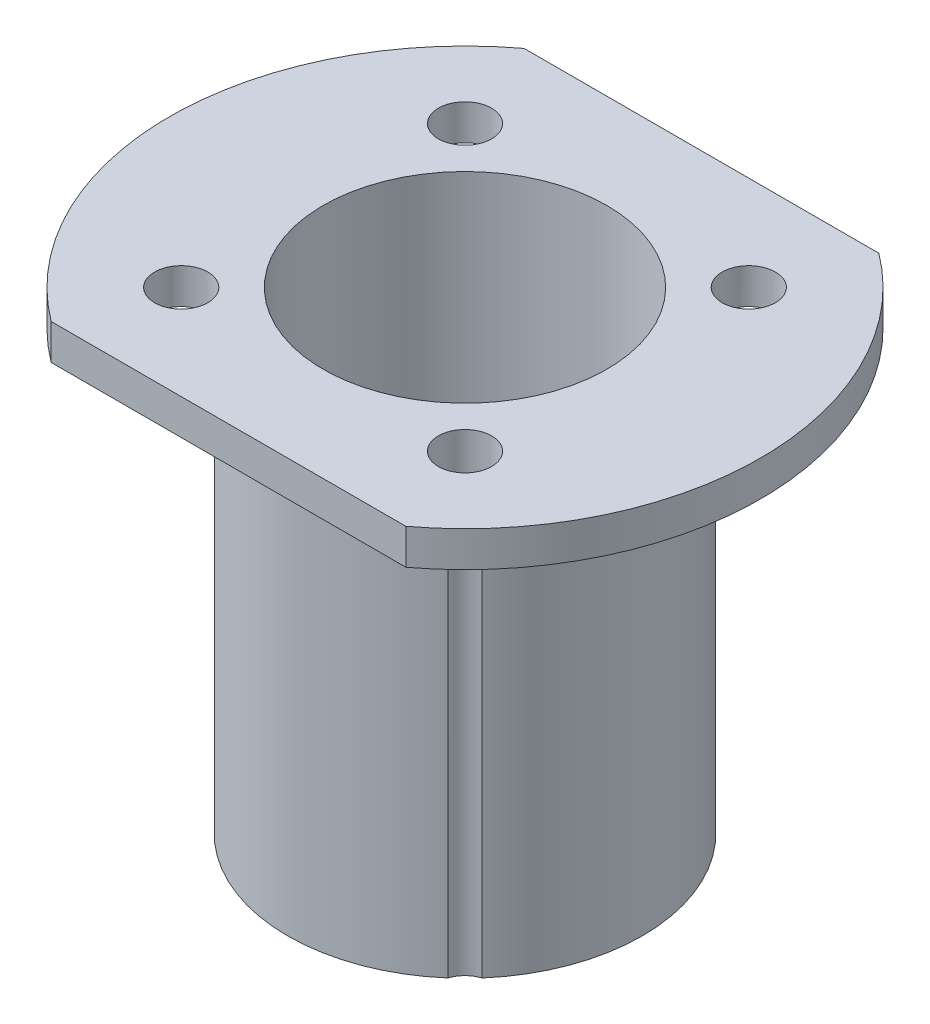
ISO-10303-21;
HEADER;
FILE_DESCRIPTION(('STEP AP214'),'2;1');
FILE_NAME('part.step','',(''),(''),'','','');
FILE_SCHEMA(('AUTOMOTIVE_DESIGN { 1 0 10303 214 1 1 1 1 }'));
ENDSEC;
DATA;
#1=APPLICATION_CONTEXT('core data for automotive mechanical design processes');
#2=APPLICATION_PROTOCOL_DEFINITION('international standard','automotive_design',2000,#1);
#3=PRODUCT_CONTEXT('',#1,'mechanical');
#4=PRODUCT('Part','Part','',(#3));
#5=PRODUCT_RELATED_PRODUCT_CATEGORY('part','',(#4));
#6=PRODUCT_DEFINITION_FORMATION('','',#4);
#7=PRODUCT_DEFINITION_CONTEXT('part definition',#1,'design');
#8=PRODUCT_DEFINITION('design','',#6,#7);
#9=PRODUCT_DEFINITION_SHAPE('','',#8);
#10=(LENGTH_UNIT() NAMED_UNIT(*) SI_UNIT(.MILLI.,.METRE.));
#11=(NAMED_UNIT(*) PLANE_ANGLE_UNIT() SI_UNIT($,.RADIAN.));
#12=(NAMED_UNIT(*) SI_UNIT($,.STERADIAN.) SOLID_ANGLE_UNIT());
#13=UNCERTAINTY_MEASURE_WITH_UNIT(LENGTH_MEASURE(1.E-05),#10,'distance_accuracy_value','');
#14=(GEOMETRIC_REPRESENTATION_CONTEXT(3) GLOBAL_UNCERTAINTY_ASSIGNED_CONTEXT((#13)) GLOBAL_UNIT_ASSIGNED_CONTEXT((#10,
#11,#12)) REPRESENTATION_CONTEXT('',''));
#15=CARTESIAN_POINT('',(0.,0.,0.));
#16=DIRECTION('',(0.,0.,1.));
#17=DIRECTION('',(1.,0.,0.));
#18=AXIS2_PLACEMENT_3D('',#15,#16,#17);
#19=CARTESIAN_POINT('',(0.,0.,0.));
#20=DIRECTION('',(0.,-1.,0.));
#21=DIRECTION('',(0.,0.,-1.));
#22=AXIS2_PLACEMENT_3D('',#19,#20,#21);
#23=CYLINDRICAL_SURFACE('',#22,15.);
#24=DIRECTION('',(0.,1.,0.));
#25=VECTOR('',#24,1.);
#26=CARTESIAN_POINT('',(-9.8604949556783,20.,-11.3035675443217));
#27=LINE('',#26,#25);
#28=CARTESIAN_POINT('',(-9.86049495567831,37.,-11.3035675443217));
#29=VERTEX_POINT('',#28);
#30=CARTESIAN_POINT('',(-9.8604949556783,0.,-11.3035675443217));
#31=VERTEX_POINT('',#30);
#32=EDGE_CURVE('E12',#29,#31,#27,.F.);
#33=ORIENTED_EDGE('',*,*,#32,.F.);
#34=CARTESIAN_POINT('',(0.,37.,0.));
#35=DIRECTION('',(0.,-1.,0.));
#36=DIRECTION('',(0.,0.,-1.));
#37=AXIS2_PLACEMENT_3D('',#34,#35,#36);
#38=CIRCLE('',#37,15.);
#39=CARTESIAN_POINT('',(9.86049495567869,37.,-11.3035675443214));
#40=VERTEX_POINT('',#39);
#41=EDGE_CURVE('E183',#29,#40,#38,.T.);
#42=ORIENTED_EDGE('',*,*,#41,.T.);
#43=DIRECTION('',(0.,1.,0.));
#44=VECTOR('',#43,1.);
#45=CARTESIAN_POINT('',(9.86049495567869,20.,-11.3035675443213));
#46=LINE('',#45,#44);
#47=CARTESIAN_POINT('',(9.86049495567869,0.,-11.3035675443214));
#48=VERTEX_POINT('',#47);
#49=EDGE_CURVE('E137',#48,#40,#46,.T.);
#50=ORIENTED_EDGE('',*,*,#49,.F.);
#51=CARTESIAN_POINT('',(0.,0.,0.));
#52=DIRECTION('',(0.,-1.,0.));
#53=DIRECTION('',(0.,0.,-1.));
#54=AXIS2_PLACEMENT_3D('',#51,#52,#53);
#55=CIRCLE('',#54,15.);
#56=EDGE_CURVE('E55',#31,#48,#55,.T.);
#57=ORIENTED_EDGE('',*,*,#56,.F.);
#58=EDGE_LOOP('',(#33,#42,#50,#57));
#59=FACE_BOUND('',#58,.T.);
#60=ADVANCED_FACE('F34',(#59),#23,.T.);
#61=DIRECTION('',(0.,1.,0.));
#62=VECTOR('',#61,1.);
#63=CARTESIAN_POINT('',(11.3035675443207,20.,-9.8604949556794));
#64=LINE('',#63,#62);
#65=CARTESIAN_POINT('',(11.3035675443207,37.,-9.86049495567941));
#66=VERTEX_POINT('',#65);
#67=CARTESIAN_POINT('',(11.3035675443207,0.,-9.8604949556794));
#68=VERTEX_POINT('',#67);
#69=EDGE_CURVE('E174',#66,#68,#64,.F.);
#70=ORIENTED_EDGE('',*,*,#69,.F.);
#71=CARTESIAN_POINT('',(11.3035675443223,37.,9.86049495567759));
#72=VERTEX_POINT('',#71);
#73=EDGE_CURVE('E189',#66,#72,#38,.T.);
#74=ORIENTED_EDGE('',*,*,#73,.T.);
#75=DIRECTION('',(0.,1.,0.));
#76=VECTOR('',#75,1.);
#77=CARTESIAN_POINT('',(11.3035675443223,20.,9.86049495567758));
#78=LINE('',#77,#76);
#79=CARTESIAN_POINT('',(11.3035675443223,0.,9.86049495567759));
#80=VERTEX_POINT('',#79);
#81=EDGE_CURVE('E168',#80,#72,#78,.T.);
#82=ORIENTED_EDGE('',*,*,#81,.F.);
#83=EDGE_CURVE('E138',#68,#80,#55,.T.);
#84=ORIENTED_EDGE('',*,*,#83,.F.);
#85=EDGE_LOOP('',(#70,#74,#82,#84));
#86=FACE_BOUND('',#85,.T.);
#87=ADVANCED_FACE('F274',(#86),#23,.T.);
#88=DIRECTION('',(0.,1.,0.));
#89=VECTOR('',#88,1.);
#90=CARTESIAN_POINT('',(9.86049495567904,20.,11.303567544321));
#91=LINE('',#90,#89);
#92=CARTESIAN_POINT('',(9.86049495567905,37.,11.303567544321));
#93=VERTEX_POINT('',#92);
#94=CARTESIAN_POINT('',(9.86049495567904,0.,11.303567544321));
#95=VERTEX_POINT('',#94);
#96=EDGE_CURVE('E171',#93,#95,#91,.F.);
#97=ORIENTED_EDGE('',*,*,#96,.F.);
#98=CARTESIAN_POINT('',(-9.86049495567721,37.,11.3035675443226));
#99=VERTEX_POINT('',#98);
#100=EDGE_CURVE('E188',#93,#99,#38,.T.);
#101=ORIENTED_EDGE('',*,*,#100,.T.);
#102=DIRECTION('',(0.,1.,0.));
#103=VECTOR('',#102,1.);
#104=CARTESIAN_POINT('',(-9.86049495567721,20.,11.3035675443226));
#105=LINE('',#104,#103);
#106=CARTESIAN_POINT('',(-9.86049495567721,0.,11.3035675443226));
#107=VERTEX_POINT('',#106);
#108=EDGE_CURVE('E163',#107,#99,#105,.T.);
#109=ORIENTED_EDGE('',*,*,#108,.F.);
#110=EDGE_CURVE('E141',#95,#107,#55,.T.);
#111=ORIENTED_EDGE('',*,*,#110,.F.);
#112=EDGE_LOOP('',(#97,#101,#109,#111));
#113=FACE_BOUND('',#112,.T.);
#114=ADVANCED_FACE('F242',(#113),#23,.T.);
#115=CARTESIAN_POINT('',(25.,40.,0.));
#116=DIRECTION('',(0.,1.,0.));
#117=DIRECTION('',(0.,0.,1.));
#118=AXIS2_PLACEMENT_3D('',#115,#116,#117);
#119=PLANE('',#118);
#120=CARTESIAN_POINT('',(-12.,40.,-12.));
#121=DIRECTION('',(0.,1.,0.));
#122=DIRECTION('',(0.,0.,1.));
#123=AXIS2_PLACEMENT_3D('',#120,#121,#122);
#124=CIRCLE('',#123,2.25);
#125=CARTESIAN_POINT('',(-12.,40.,-9.75));
#126=VERTEX_POINT('',#125);
#127=EDGE_CURVE('E133',#126,#126,#124,.T.);
#128=ORIENTED_EDGE('',*,*,#127,.F.);
#129=EDGE_LOOP('',(#128));
#130=FACE_BOUND('',#129,.T.);
#131=CARTESIAN_POINT('',(12.,40.,-12.0000000000008));
#132=DIRECTION('',(0.,1.,0.));
#133=DIRECTION('',(0.,0.,1.));
#134=AXIS2_PLACEMENT_3D('',#131,#132,#133);
#135=CIRCLE('',#134,2.25);
#136=CARTESIAN_POINT('',(12.,40.,-9.75000000000076));
#137=VERTEX_POINT('',#136);
#138=EDGE_CURVE('E184',#137,#137,#135,.T.);
#139=ORIENTED_EDGE('',*,*,#138,.F.);
#140=EDGE_LOOP('',(#139));
#141=FACE_BOUND('',#140,.T.);
#142=CARTESIAN_POINT('',(12.0000000000008,40.,11.9999999999992));
#143=DIRECTION('',(0.,1.,0.));
#144=DIRECTION('',(0.,0.,1.));
#145=AXIS2_PLACEMENT_3D('',#142,#143,#144);
#146=CIRCLE('',#145,2.25);
#147=CARTESIAN_POINT('',(12.0000000000008,40.,14.2499999999992));
#148=VERTEX_POINT('',#147);
#149=EDGE_CURVE('E228',#148,#148,#146,.T.);
#150=ORIENTED_EDGE('',*,*,#149,.F.);
#151=EDGE_LOOP('',(#150));
#152=FACE_BOUND('',#151,.T.);
#153=CARTESIAN_POINT('',(-11.9999999999992,40.,12.));
#154=DIRECTION('',(0.,1.,0.));
#155=DIRECTION('',(0.,0.,1.));
#156=AXIS2_PLACEMENT_3D('',#153,#154,#155);
#157=CIRCLE('',#156,2.25);
#158=CARTESIAN_POINT('',(-11.9999999999992,40.,14.25));
#159=VERTEX_POINT('',#158);
#160=EDGE_CURVE('E220',#159,#159,#157,.T.);
#161=ORIENTED_EDGE('',*,*,#160,.F.);
#162=EDGE_LOOP('',(#161));
#163=FACE_BOUND('',#162,.T.);
#164=CARTESIAN_POINT('',(0.,40.,0.));
#165=DIRECTION('',(0.,-1.,0.));
#166=DIRECTION('',(0.,0.,-1.));
#167=AXIS2_PLACEMENT_3D('',#164,#165,#166);
#168=CIRCLE('',#167,12.);
#169=CARTESIAN_POINT('',(0.,40.,-12.));
#170=VERTEX_POINT('',#169);
#171=EDGE_CURVE('E148',#170,#170,#168,.T.);
#172=ORIENTED_EDGE('',*,*,#171,.T.);
#173=EDGE_LOOP('',(#172));
#174=FACE_BOUND('',#173,.T.);
#175=CARTESIAN_POINT('',(0.,40.,0.));
#176=DIRECTION('',(0.,-1.,0.));
#177=DIRECTION('',(0.,0.,-1.));
#178=AXIS2_PLACEMENT_3D('',#175,#176,#177);
#179=CIRCLE('',#178,25.);
#180=CARTESIAN_POINT('',(15.,40.,-20.));
#181=VERTEX_POINT('',#180);
#182=CARTESIAN_POINT('',(15.,40.,20.));
#183=VERTEX_POINT('',#182);
#184=EDGE_CURVE('E201',#181,#183,#179,.T.);
#185=ORIENTED_EDGE('',*,*,#184,.F.);
#186=DIRECTION('',(-1.,0.,0.));
#187=VECTOR('',#186,1.);
#188=CARTESIAN_POINT('',(49.765,40.,-20.));
#189=LINE('',#188,#187);
#190=CARTESIAN_POINT('',(-15.,40.,-20.));
#191=VERTEX_POINT('',#190);
#192=EDGE_CURVE('E210',#181,#191,#189,.T.);
#193=ORIENTED_EDGE('',*,*,#192,.T.);
#194=CARTESIAN_POINT('',(-15.,40.,20.));
#195=VERTEX_POINT('',#194);
#196=EDGE_CURVE('E205',#195,#191,#179,.T.);
#197=ORIENTED_EDGE('',*,*,#196,.F.);
#198=DIRECTION('',(1.,0.,0.));
#199=VECTOR('',#198,1.);
#200=CARTESIAN_POINT('',(49.765,40.,20.));
#201=LINE('',#200,#199);
#202=EDGE_CURVE('E213',#195,#183,#201,.T.);
#203=ORIENTED_EDGE('',*,*,#202,.T.);
#204=EDGE_LOOP('',(#185,#193,#197,#203));
#205=FACE_BOUND('',#204,.T.);
#206=ADVANCED_FACE('F36',(#130,#141,#152,#163,#174,#205),#119,.T.);
#207=CARTESIAN_POINT('',(15.,37.,0.));
#208=DIRECTION('',(0.,-1.,0.));
#209=DIRECTION('',(0.,0.,-1.));
#210=AXIS2_PLACEMENT_3D('',#207,#208,#209);
#211=PLANE('',#210);
#212=CARTESIAN_POINT('',(-12.,37.,-12.));
#213=DIRECTION('',(0.,-1.,0.));
#214=DIRECTION('',(0.,0.,-1.));
#215=AXIS2_PLACEMENT_3D('',#212,#213,#214);
#216=CIRCLE('',#215,2.24999999999999);
#217=CARTESIAN_POINT('',(-11.3035675443217,37.,-9.86049495567833));
#218=VERTEX_POINT('',#217);
#219=EDGE_CURVE('E124',#218,#29,#216,.T.);
#220=ORIENTED_EDGE('',*,*,#219,.F.);
#221=CARTESIAN_POINT('',(-11.303567544322,37.,9.86049495567793));
#222=VERTEX_POINT('',#221);
#223=EDGE_CURVE('E144',#222,#218,#38,.T.);
#224=ORIENTED_EDGE('',*,*,#223,.F.);
#225=CARTESIAN_POINT('',(-11.9999999999992,37.,12.));
#226=DIRECTION('',(0.,-1.,0.));
#227=DIRECTION('',(0.,0.,-1.));
#228=AXIS2_PLACEMENT_3D('',#225,#226,#227);
#229=CIRCLE('',#228,2.24999999999999);
#230=EDGE_CURVE('E216',#99,#222,#229,.T.);
#231=ORIENTED_EDGE('',*,*,#230,.F.);
#232=ORIENTED_EDGE('',*,*,#100,.F.);
#233=CARTESIAN_POINT('',(12.0000000000008,37.,11.9999999999992));
#234=DIRECTION('',(0.,-1.,0.));
#235=DIRECTION('',(0.,0.,-1.));
#236=AXIS2_PLACEMENT_3D('',#233,#234,#235);
#237=CIRCLE('',#236,2.24999999999999);
#238=EDGE_CURVE('E223',#72,#93,#237,.T.);
#239=ORIENTED_EDGE('',*,*,#238,.F.);
#240=ORIENTED_EDGE('',*,*,#73,.F.);
#241=CARTESIAN_POINT('',(12.,37.,-12.0000000000008));
#242=DIRECTION('',(0.,-1.,0.));
#243=DIRECTION('',(0.,0.,-1.));
#244=AXIS2_PLACEMENT_3D('',#241,#242,#243);
#245=CIRCLE('',#244,2.24999999999999);
#246=EDGE_CURVE('E231',#40,#66,#245,.T.);
#247=ORIENTED_EDGE('',*,*,#246,.F.);
#248=ORIENTED_EDGE('',*,*,#41,.F.);
#249=EDGE_LOOP('',(#220,#224,#231,#232,#239,#240,#247,#248));
#250=FACE_BOUND('',#249,.T.);
#251=CARTESIAN_POINT('',(0.,37.,0.));
#252=DIRECTION('',(0.,-1.,0.));
#253=DIRECTION('',(0.,0.,-1.));
#254=AXIS2_PLACEMENT_3D('',#251,#252,#253);
#255=CIRCLE('',#254,25.);
#256=CARTESIAN_POINT('',(-15.,37.,20.));
#257=VERTEX_POINT('',#256);
#258=CARTESIAN_POINT('',(-15.,37.,-20.));
#259=VERTEX_POINT('',#258);
#260=EDGE_CURVE('E196',#257,#259,#255,.T.);
#261=ORIENTED_EDGE('',*,*,#260,.T.);
#262=DIRECTION('',(1.,0.,0.));
#263=VECTOR('',#262,1.);
#264=CARTESIAN_POINT('',(15.,37.,-20.));
#265=LINE('',#264,#263);
#266=CARTESIAN_POINT('',(15.,37.,-20.));
#267=VERTEX_POINT('',#266);
#268=EDGE_CURVE('E206',#259,#267,#265,.T.);
#269=ORIENTED_EDGE('',*,*,#268,.T.);
#270=CARTESIAN_POINT('',(15.,37.,20.));
#271=VERTEX_POINT('',#270);
#272=EDGE_CURVE('E190',#267,#271,#255,.T.);
#273=ORIENTED_EDGE('',*,*,#272,.T.);
#274=DIRECTION('',(-1.,0.,0.));
#275=VECTOR('',#274,1.);
#276=CARTESIAN_POINT('',(15.,37.,20.));
#277=LINE('',#276,#275);
#278=EDGE_CURVE('E208',#271,#257,#277,.T.);
#279=ORIENTED_EDGE('',*,*,#278,.T.);
#280=EDGE_LOOP('',(#261,#269,#273,#279));
#281=FACE_BOUND('',#280,.T.);
#282=ADVANCED_FACE('F179',(#250,#281),#211,.T.);
#283=CARTESIAN_POINT('',(0.,0.,0.));
#284=DIRECTION('',(0.,-1.,0.));
#285=DIRECTION('',(0.,0.,-1.));
#286=AXIS2_PLACEMENT_3D('',#283,#284,#285);
#287=CYLINDRICAL_SURFACE('',#286,25.);
#288=ORIENTED_EDGE('',*,*,#272,.F.);
#289=DIRECTION('',(0.,-1.,0.));
#290=VECTOR('',#289,1.);
#291=CARTESIAN_POINT('',(15.,0.,-20.));
#292=LINE('',#291,#290);
#293=EDGE_CURVE('E160',#267,#181,#292,.F.);
#294=ORIENTED_EDGE('',*,*,#293,.T.);
#295=ORIENTED_EDGE('',*,*,#184,.T.);
#296=DIRECTION('',(0.,-1.,0.));
#297=VECTOR('',#296,1.);
#298=CARTESIAN_POINT('',(15.,0.,20.));
#299=LINE('',#298,#297);
#300=EDGE_CURVE('E151',#183,#271,#299,.T.);
#301=ORIENTED_EDGE('',*,*,#300,.T.);
#302=EDGE_LOOP('',(#288,#294,#295,#301));
#303=FACE_BOUND('',#302,.T.);
#304=ADVANCED_FACE('F255',(#303),#287,.T.);
#305=ORIENTED_EDGE('',*,*,#196,.T.);
#306=DIRECTION('',(0.,-1.,0.));
#307=VECTOR('',#306,1.);
#308=CARTESIAN_POINT('',(-15.,0.,-20.));
#309=LINE('',#308,#307);
#310=EDGE_CURVE('E157',#191,#259,#309,.T.);
#311=ORIENTED_EDGE('',*,*,#310,.T.);
#312=ORIENTED_EDGE('',*,*,#260,.F.);
#313=DIRECTION('',(0.,-1.,0.));
#314=VECTOR('',#313,1.);
#315=CARTESIAN_POINT('',(-15.,0.,20.));
#316=LINE('',#315,#314);
#317=EDGE_CURVE('E154',#257,#195,#316,.F.);
#318=ORIENTED_EDGE('',*,*,#317,.T.);
#319=EDGE_LOOP('',(#305,#311,#312,#318));
#320=FACE_BOUND('',#319,.T.);
#321=ADVANCED_FACE('F260',(#320),#287,.T.);
#322=CARTESIAN_POINT('',(0.,0.,0.));
#323=DIRECTION('',(0.,-1.,0.));
#324=DIRECTION('',(0.,0.,-1.));
#325=AXIS2_PLACEMENT_3D('',#322,#323,#324);
#326=CYLINDRICAL_SURFACE('',#325,12.);
#327=CARTESIAN_POINT('',(0.,0.,0.));
#328=DIRECTION('',(0.,-1.,0.));
#329=DIRECTION('',(0.,0.,-1.));
#330=AXIS2_PLACEMENT_3D('',#327,#328,#329);
#331=CIRCLE('',#330,12.);
#332=CARTESIAN_POINT('',(0.,0.,-12.));
#333=VERTEX_POINT('',#332);
#334=EDGE_CURVE('E140',#333,#333,#331,.T.);
#335=ORIENTED_EDGE('',*,*,#334,.T.);
#336=EDGE_LOOP('',(#335));
#337=FACE_BOUND('',#336,.T.);
#338=ORIENTED_EDGE('',*,*,#171,.F.);
#339=EDGE_LOOP('',(#338));
#340=FACE_BOUND('',#339,.T.);
#341=ADVANCED_FACE('F282',(#337,#340),#326,.F.);
#342=CARTESIAN_POINT('',(12.,0.,0.));
#343=DIRECTION('',(0.,-1.,0.));
#344=DIRECTION('',(0.,0.,-1.));
#345=AXIS2_PLACEMENT_3D('',#342,#343,#344);
#346=PLANE('',#345);
#347=CARTESIAN_POINT('',(-12.,0.,-12.));
#348=DIRECTION('',(0.,1.,0.));
#349=DIRECTION('',(0.,0.,1.));
#350=AXIS2_PLACEMENT_3D('',#347,#348,#349);
#351=CIRCLE('',#350,2.24999999999999);
#352=CARTESIAN_POINT('',(-11.3035675443217,0.,-9.86049495567833));
#353=VERTEX_POINT('',#352);
#354=EDGE_CURVE('E48',#353,#31,#351,.T.);
#355=ORIENTED_EDGE('',*,*,#354,.T.);
#356=ORIENTED_EDGE('',*,*,#56,.T.);
#357=CARTESIAN_POINT('',(12.,0.,-12.0000000000008));
#358=DIRECTION('',(0.,1.,0.));
#359=DIRECTION('',(0.,0.,1.));
#360=AXIS2_PLACEMENT_3D('',#357,#358,#359);
#361=CIRCLE('',#360,2.24999999999999);
#362=EDGE_CURVE('E233',#48,#68,#361,.T.);
#363=ORIENTED_EDGE('',*,*,#362,.T.);
#364=ORIENTED_EDGE('',*,*,#83,.T.);
#365=CARTESIAN_POINT('',(12.0000000000008,0.,11.9999999999992));
#366=DIRECTION('',(0.,1.,0.));
#367=DIRECTION('',(0.,0.,1.));
#368=AXIS2_PLACEMENT_3D('',#365,#366,#367);
#369=CIRCLE('',#368,2.24999999999999);
#370=EDGE_CURVE('E225',#80,#95,#369,.T.);
#371=ORIENTED_EDGE('',*,*,#370,.T.);
#372=ORIENTED_EDGE('',*,*,#110,.T.);
#373=CARTESIAN_POINT('',(-11.9999999999992,0.,12.));
#374=DIRECTION('',(0.,1.,0.));
#375=DIRECTION('',(0.,0.,1.));
#376=AXIS2_PLACEMENT_3D('',#373,#374,#375);
#377=CIRCLE('',#376,2.24999999999999);
#378=CARTESIAN_POINT('',(-11.303567544322,0.,9.86049495567793));
#379=VERTEX_POINT('',#378);
#380=EDGE_CURVE('E218',#107,#379,#377,.T.);
#381=ORIENTED_EDGE('',*,*,#380,.T.);
#382=EDGE_CURVE('E132',#379,#353,#55,.T.);
#383=ORIENTED_EDGE('',*,*,#382,.T.);
#384=EDGE_LOOP('',(#355,#356,#363,#364,#371,#372,#381,#383));
#385=FACE_BOUND('',#384,.T.);
#386=ORIENTED_EDGE('',*,*,#334,.F.);
#387=EDGE_LOOP('',(#386));
#388=FACE_BOUND('',#387,.T.);
#389=ADVANCED_FACE('F128',(#385,#388),#346,.T.);
#390=DIRECTION('',(0.,1.,0.));
#391=VECTOR('',#390,1.);
#392=CARTESIAN_POINT('',(-11.3035675443217,20.,-9.86049495567833));
#393=LINE('',#392,#391);
#394=EDGE_CURVE('E42',#353,#218,#393,.T.);
#395=ORIENTED_EDGE('',*,*,#394,.F.);
#396=ORIENTED_EDGE('',*,*,#382,.F.);
#397=DIRECTION('',(0.,1.,0.));
#398=VECTOR('',#397,1.);
#399=CARTESIAN_POINT('',(-11.303567544322,20.,9.86049495567793));
#400=LINE('',#399,#398);
#401=EDGE_CURVE('E166',#222,#379,#400,.F.);
#402=ORIENTED_EDGE('',*,*,#401,.F.);
#403=ORIENTED_EDGE('',*,*,#223,.T.);
#404=EDGE_LOOP('',(#395,#396,#402,#403));
#405=FACE_BOUND('',#404,.T.);
#406=ADVANCED_FACE('F187',(#405),#23,.T.);
#407=CARTESIAN_POINT('',(49.765,-1.2E-05,20.));
#408=DIRECTION('',(0.,0.,1.));
#409=DIRECTION('',(1.,0.,0.));
#410=AXIS2_PLACEMENT_3D('',#407,#408,#409);
#411=PLANE('',#410);
#412=ORIENTED_EDGE('',*,*,#278,.F.);
#413=ORIENTED_EDGE('',*,*,#300,.F.);
#414=ORIENTED_EDGE('',*,*,#202,.F.);
#415=ORIENTED_EDGE('',*,*,#317,.F.);
#416=EDGE_LOOP('',(#412,#413,#414,#415));
#417=FACE_BOUND('',#416,.T.);
#418=ADVANCED_FACE('F262',(#417),#411,.T.);
#419=CARTESIAN_POINT('',(49.765,-1.2E-05,-20.));
#420=DIRECTION('',(0.,0.,-1.));
#421=DIRECTION('',(-1.,0.,0.));
#422=AXIS2_PLACEMENT_3D('',#419,#420,#421);
#423=PLANE('',#422);
#424=ORIENTED_EDGE('',*,*,#268,.F.);
#425=ORIENTED_EDGE('',*,*,#310,.F.);
#426=ORIENTED_EDGE('',*,*,#192,.F.);
#427=ORIENTED_EDGE('',*,*,#293,.F.);
#428=EDGE_LOOP('',(#424,#425,#426,#427));
#429=FACE_BOUND('',#428,.T.);
#430=ADVANCED_FACE('F257',(#429),#423,.T.);
#431=CARTESIAN_POINT('',(-11.9999999999992,40.,12.));
#432=DIRECTION('',(0.,1.,0.));
#433=DIRECTION('',(0.,0.,1.));
#434=AXIS2_PLACEMENT_3D('',#431,#432,#433);
#435=CYLINDRICAL_SURFACE('',#434,2.24999999999999);
#436=ORIENTED_EDGE('',*,*,#401,.T.);
#437=ORIENTED_EDGE('',*,*,#380,.F.);
#438=ORIENTED_EDGE('',*,*,#108,.T.);
#439=ORIENTED_EDGE('',*,*,#230,.T.);
#440=EDGE_LOOP('',(#436,#437,#438,#439));
#441=FACE_BOUND('',#440,.T.);
#442=ORIENTED_EDGE('',*,*,#160,.T.);
#443=EDGE_LOOP('',(#442));
#444=FACE_BOUND('',#443,.T.);
#445=ADVANCED_FACE('F269',(#441,#444),#435,.F.);
#446=CARTESIAN_POINT('',(12.0000000000008,40.,11.9999999999992));
#447=DIRECTION('',(0.,1.,0.));
#448=DIRECTION('',(0.,0.,1.));
#449=AXIS2_PLACEMENT_3D('',#446,#447,#448);
#450=CYLINDRICAL_SURFACE('',#449,2.24999999999999);
#451=ORIENTED_EDGE('',*,*,#96,.T.);
#452=ORIENTED_EDGE('',*,*,#370,.F.);
#453=ORIENTED_EDGE('',*,*,#81,.T.);
#454=ORIENTED_EDGE('',*,*,#238,.T.);
#455=EDGE_LOOP('',(#451,#452,#453,#454));
#456=FACE_BOUND('',#455,.T.);
#457=ORIENTED_EDGE('',*,*,#149,.T.);
#458=EDGE_LOOP('',(#457));
#459=FACE_BOUND('',#458,.T.);
#460=ADVANCED_FACE('F357',(#456,#459),#450,.F.);
#461=CARTESIAN_POINT('',(12.,40.,-12.0000000000008));
#462=DIRECTION('',(0.,1.,0.));
#463=DIRECTION('',(0.,0.,1.));
#464=AXIS2_PLACEMENT_3D('',#461,#462,#463);
#465=CYLINDRICAL_SURFACE('',#464,2.24999999999999);
#466=ORIENTED_EDGE('',*,*,#69,.T.);
#467=ORIENTED_EDGE('',*,*,#362,.F.);
#468=ORIENTED_EDGE('',*,*,#49,.T.);
#469=ORIENTED_EDGE('',*,*,#246,.T.);
#470=EDGE_LOOP('',(#466,#467,#468,#469));
#471=FACE_BOUND('',#470,.T.);
#472=ORIENTED_EDGE('',*,*,#138,.T.);
#473=EDGE_LOOP('',(#472));
#474=FACE_BOUND('',#473,.T.);
#475=ADVANCED_FACE('F367',(#471,#474),#465,.F.);
#476=CARTESIAN_POINT('',(-12.,40.,-12.));
#477=DIRECTION('',(0.,1.,0.));
#478=DIRECTION('',(0.,0.,1.));
#479=AXIS2_PLACEMENT_3D('',#476,#477,#478);
#480=CYLINDRICAL_SURFACE('',#479,2.24999999999999);
#481=ORIENTED_EDGE('',*,*,#32,.T.);
#482=ORIENTED_EDGE('',*,*,#354,.F.);
#483=ORIENTED_EDGE('',*,*,#394,.T.);
#484=ORIENTED_EDGE('',*,*,#219,.T.);
#485=EDGE_LOOP('',(#481,#482,#483,#484));
#486=FACE_BOUND('',#485,.T.);
#487=ORIENTED_EDGE('',*,*,#127,.T.);
#488=EDGE_LOOP('',(#487));
#489=FACE_BOUND('',#488,.T.);
#490=ADVANCED_FACE('F121',(#486,#489),#480,.F.);
#491=CLOSED_SHELL('',(#60,#87,#114,#206,#282,#304,#321,#341,#389,#406,#418,#430,#445,#460,#475,#490));
#492=MANIFOLD_SOLID_BREP('B2',#491);
#493=ADVANCED_BREP_SHAPE_REPRESENTATION('',(#18,#492),#14);
#494=SHAPE_DEFINITION_REPRESENTATION(#9,#493);
ENDSEC;
END-ISO-10303-21;
